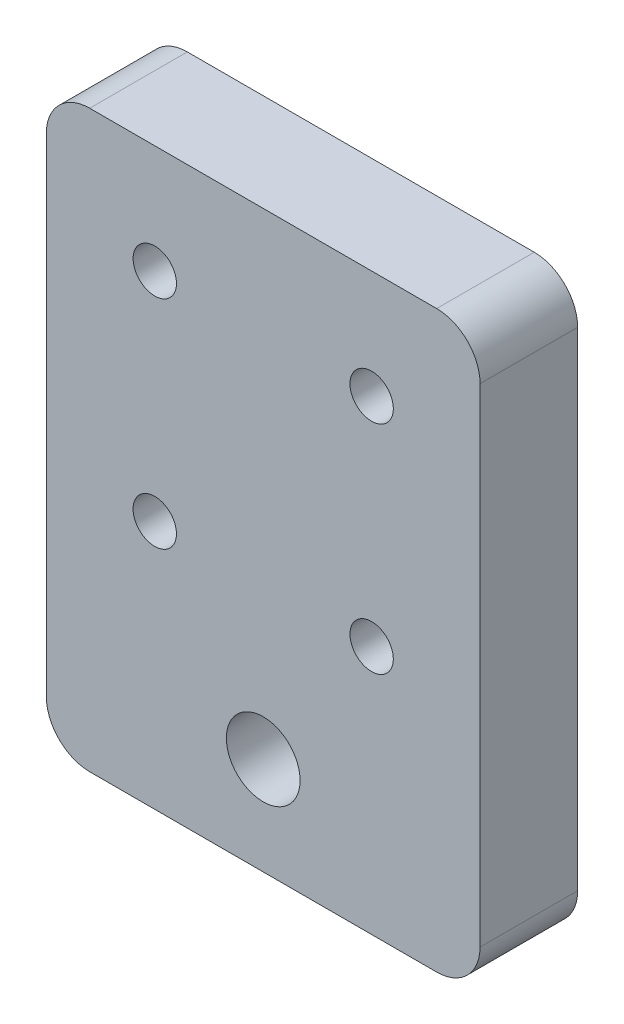
ISO-10303-21;
HEADER;
FILE_DESCRIPTION(('STEP AP214'),'2;1');
FILE_NAME('part.step','',(''),(''),'','','');
FILE_SCHEMA(('AUTOMOTIVE_DESIGN { 1 0 10303 214 1 1 1 1 }'));
ENDSEC;
DATA;
#1=APPLICATION_CONTEXT('core data for automotive mechanical design processes');
#2=APPLICATION_PROTOCOL_DEFINITION('international standard','automotive_design',2000,#1);
#3=PRODUCT_CONTEXT('',#1,'mechanical');
#4=PRODUCT('Part','Part','',(#3));
#5=PRODUCT_RELATED_PRODUCT_CATEGORY('part','',(#4));
#6=PRODUCT_DEFINITION_FORMATION('','',#4);
#7=PRODUCT_DEFINITION_CONTEXT('part definition',#1,'design');
#8=PRODUCT_DEFINITION('design','',#6,#7);
#9=PRODUCT_DEFINITION_SHAPE('','',#8);
#10=(LENGTH_UNIT() NAMED_UNIT(*) SI_UNIT(.MILLI.,.METRE.));
#11=(NAMED_UNIT(*) PLANE_ANGLE_UNIT() SI_UNIT($,.RADIAN.));
#12=(NAMED_UNIT(*) SI_UNIT($,.STERADIAN.) SOLID_ANGLE_UNIT());
#13=UNCERTAINTY_MEASURE_WITH_UNIT(LENGTH_MEASURE(1.E-05),#10,'distance_accuracy_value','');
#14=(GEOMETRIC_REPRESENTATION_CONTEXT(3) GLOBAL_UNCERTAINTY_ASSIGNED_CONTEXT((#13)) GLOBAL_UNIT_ASSIGNED_CONTEXT((#10,
#11,#12)) REPRESENTATION_CONTEXT('',''));
#15=CARTESIAN_POINT('',(0.,0.,0.));
#16=DIRECTION('',(0.,0.,1.));
#17=DIRECTION('',(1.,0.,0.));
#18=AXIS2_PLACEMENT_3D('',#15,#16,#17);
#19=CARTESIAN_POINT('',(0.,0.,9.));
#20=DIRECTION('',(1.,0.,0.));
#21=DIRECTION('',(0.,0.,-1.));
#22=AXIS2_PLACEMENT_3D('',#19,#20,#21);
#23=PLANE('',#22);
#24=DIRECTION('',(0.,-1.,0.));
#25=VECTOR('',#24,1.);
#26=CARTESIAN_POINT('',(0.,0.,0.));
#27=LINE('',#26,#25);
#28=CARTESIAN_POINT('',(0.,49.,0.));
#29=VERTEX_POINT('',#28);
#30=CARTESIAN_POINT('',(0.,4.,0.));
#31=VERTEX_POINT('',#30);
#32=EDGE_CURVE('E157',#29,#31,#27,.T.);
#33=ORIENTED_EDGE('',*,*,#32,.T.);
#34=DIRECTION('',(0.,0.,-1.));
#35=VECTOR('',#34,1.);
#36=CARTESIAN_POINT('',(0.,4.,9.));
#37=LINE('',#36,#35);
#38=CARTESIAN_POINT('',(0.,4.,9.));
#39=VERTEX_POINT('',#38);
#40=EDGE_CURVE('E11',#31,#39,#37,.F.);
#41=ORIENTED_EDGE('',*,*,#40,.T.);
#42=DIRECTION('',(0.,-1.,0.));
#43=VECTOR('',#42,1.);
#44=CARTESIAN_POINT('',(0.,0.,9.));
#45=LINE('',#44,#43);
#46=CARTESIAN_POINT('',(0.,49.,9.));
#47=VERTEX_POINT('',#46);
#48=EDGE_CURVE('E125',#47,#39,#45,.T.);
#49=ORIENTED_EDGE('',*,*,#48,.F.);
#50=DIRECTION('',(0.,0.,-1.));
#51=VECTOR('',#50,1.);
#52=CARTESIAN_POINT('',(0.,49.,9.));
#53=LINE('',#52,#51);
#54=EDGE_CURVE('E41',#47,#29,#53,.T.);
#55=ORIENTED_EDGE('',*,*,#54,.T.);
#56=EDGE_LOOP('',(#33,#41,#49,#55));
#57=FACE_BOUND('',#56,.T.);
#58=ADVANCED_FACE('F33',(#57),#23,.F.);
#59=CARTESIAN_POINT('',(0.,0.,9.));
#60=DIRECTION('',(0.,1.,0.));
#61=DIRECTION('',(0.,0.,1.));
#62=AXIS2_PLACEMENT_3D('',#59,#60,#61);
#63=PLANE('',#62);
#64=DIRECTION('',(1.,0.,0.));
#65=VECTOR('',#64,1.);
#66=CARTESIAN_POINT('',(0.,0.,0.));
#67=LINE('',#66,#65);
#68=CARTESIAN_POINT('',(4.,0.,0.));
#69=VERTEX_POINT('',#68);
#70=CARTESIAN_POINT('',(36.,0.,0.));
#71=VERTEX_POINT('',#70);
#72=EDGE_CURVE('E130',#69,#71,#67,.T.);
#73=ORIENTED_EDGE('',*,*,#72,.T.);
#74=DIRECTION('',(0.,0.,-1.));
#75=VECTOR('',#74,1.);
#76=CARTESIAN_POINT('',(36.,0.,9.));
#77=LINE('',#76,#75);
#78=CARTESIAN_POINT('',(36.,0.,9.));
#79=VERTEX_POINT('',#78);
#80=EDGE_CURVE('E48',#71,#79,#77,.F.);
#81=ORIENTED_EDGE('',*,*,#80,.T.);
#82=DIRECTION('',(1.,0.,0.));
#83=VECTOR('',#82,1.);
#84=CARTESIAN_POINT('',(0.,0.,9.));
#85=LINE('',#84,#83);
#86=CARTESIAN_POINT('',(4.,0.,9.));
#87=VERTEX_POINT('',#86);
#88=EDGE_CURVE('E128',#87,#79,#85,.T.);
#89=ORIENTED_EDGE('',*,*,#88,.F.);
#90=DIRECTION('',(0.,0.,-1.));
#91=VECTOR('',#90,1.);
#92=CARTESIAN_POINT('',(4.,0.,9.));
#93=LINE('',#92,#91);
#94=EDGE_CURVE('E149',#87,#69,#93,.T.);
#95=ORIENTED_EDGE('',*,*,#94,.T.);
#96=EDGE_LOOP('',(#73,#81,#89,#95));
#97=FACE_BOUND('',#96,.T.);
#98=ADVANCED_FACE('F227',(#97),#63,.F.);
#99=CARTESIAN_POINT('',(40.,0.,9.));
#100=DIRECTION('',(-1.,0.,0.));
#101=DIRECTION('',(0.,0.,1.));
#102=AXIS2_PLACEMENT_3D('',#99,#100,#101);
#103=PLANE('',#102);
#104=DIRECTION('',(0.,1.,0.));
#105=VECTOR('',#104,1.);
#106=CARTESIAN_POINT('',(40.,0.,0.));
#107=LINE('',#106,#105);
#108=CARTESIAN_POINT('',(40.,4.,0.));
#109=VERTEX_POINT('',#108);
#110=CARTESIAN_POINT('',(40.,49.,0.));
#111=VERTEX_POINT('',#110);
#112=EDGE_CURVE('E126',#109,#111,#107,.T.);
#113=ORIENTED_EDGE('',*,*,#112,.T.);
#114=DIRECTION('',(0.,0.,-1.));
#115=VECTOR('',#114,1.);
#116=CARTESIAN_POINT('',(40.,49.,9.));
#117=LINE('',#116,#115);
#118=CARTESIAN_POINT('',(40.,49.,9.));
#119=VERTEX_POINT('',#118);
#120=EDGE_CURVE('E104',#111,#119,#117,.F.);
#121=ORIENTED_EDGE('',*,*,#120,.T.);
#122=DIRECTION('',(0.,1.,0.));
#123=VECTOR('',#122,1.);
#124=CARTESIAN_POINT('',(40.,0.,9.));
#125=LINE('',#124,#123);
#126=CARTESIAN_POINT('',(40.,4.,9.));
#127=VERTEX_POINT('',#126);
#128=EDGE_CURVE('E169',#127,#119,#125,.T.);
#129=ORIENTED_EDGE('',*,*,#128,.F.);
#130=DIRECTION('',(0.,0.,-1.));
#131=VECTOR('',#130,1.);
#132=CARTESIAN_POINT('',(40.,4.,9.));
#133=LINE('',#132,#131);
#134=EDGE_CURVE('E109',#127,#109,#133,.T.);
#135=ORIENTED_EDGE('',*,*,#134,.T.);
#136=EDGE_LOOP('',(#113,#121,#129,#135));
#137=FACE_BOUND('',#136,.T.);
#138=ADVANCED_FACE('F224',(#137),#103,.F.);
#139=CARTESIAN_POINT('',(0.,53.,9.));
#140=DIRECTION('',(0.,-1.,0.));
#141=DIRECTION('',(0.,0.,-1.));
#142=AXIS2_PLACEMENT_3D('',#139,#140,#141);
#143=PLANE('',#142);
#144=DIRECTION('',(-1.,0.,0.));
#145=VECTOR('',#144,1.);
#146=CARTESIAN_POINT('',(0.,53.,9.));
#147=LINE('',#146,#145);
#148=CARTESIAN_POINT('',(36.,53.,9.));
#149=VERTEX_POINT('',#148);
#150=CARTESIAN_POINT('',(4.,53.,9.));
#151=VERTEX_POINT('',#150);
#152=EDGE_CURVE('E119',#149,#151,#147,.T.);
#153=ORIENTED_EDGE('',*,*,#152,.F.);
#154=DIRECTION('',(0.,0.,-1.));
#155=VECTOR('',#154,1.);
#156=CARTESIAN_POINT('',(36.,53.,9.));
#157=LINE('',#156,#155);
#158=CARTESIAN_POINT('',(36.,53.,0.));
#159=VERTEX_POINT('',#158);
#160=EDGE_CURVE('E103',#149,#159,#157,.T.);
#161=ORIENTED_EDGE('',*,*,#160,.T.);
#162=DIRECTION('',(-1.,0.,0.));
#163=VECTOR('',#162,1.);
#164=CARTESIAN_POINT('',(0.,53.,0.));
#165=LINE('',#164,#163);
#166=CARTESIAN_POINT('',(4.,53.,0.));
#167=VERTEX_POINT('',#166);
#168=EDGE_CURVE('E116',#159,#167,#165,.T.);
#169=ORIENTED_EDGE('',*,*,#168,.T.);
#170=DIRECTION('',(0.,0.,-1.));
#171=VECTOR('',#170,1.);
#172=CARTESIAN_POINT('',(4.,53.,9.));
#173=LINE('',#172,#171);
#174=EDGE_CURVE('E121',#167,#151,#173,.F.);
#175=ORIENTED_EDGE('',*,*,#174,.T.);
#176=EDGE_LOOP('',(#153,#161,#169,#175));
#177=FACE_BOUND('',#176,.T.);
#178=ADVANCED_FACE('F115',(#177),#143,.F.);
#179=CARTESIAN_POINT('',(0.,0.,9.));
#180=DIRECTION('',(0.,0.,-1.));
#181=DIRECTION('',(-1.,0.,0.));
#182=AXIS2_PLACEMENT_3D('',#179,#180,#181);
#183=PLANE('',#182);
#184=CARTESIAN_POINT('',(30.,43.,9.));
#185=DIRECTION('',(0.,0.,1.));
#186=DIRECTION('',(-1.,0.,0.));
#187=AXIS2_PLACEMENT_3D('',#184,#185,#186);
#188=CIRCLE('',#187,2.);
#189=CARTESIAN_POINT('',(28.,43.,9.));
#190=VERTEX_POINT('',#189);
#191=EDGE_CURVE('E194',#190,#190,#188,.T.);
#192=ORIENTED_EDGE('',*,*,#191,.F.);
#193=EDGE_LOOP('',(#192));
#194=FACE_BOUND('',#193,.T.);
#195=CARTESIAN_POINT('',(30.,23.,9.));
#196=DIRECTION('',(0.,0.,1.));
#197=DIRECTION('',(1.,0.,0.));
#198=AXIS2_PLACEMENT_3D('',#195,#196,#197);
#199=CIRCLE('',#198,2.);
#200=CARTESIAN_POINT('',(32.,23.,9.));
#201=VERTEX_POINT('',#200);
#202=EDGE_CURVE('E188',#201,#201,#199,.T.);
#203=ORIENTED_EDGE('',*,*,#202,.F.);
#204=EDGE_LOOP('',(#203));
#205=FACE_BOUND('',#204,.T.);
#206=CARTESIAN_POINT('',(10.,23.,9.));
#207=DIRECTION('',(0.,0.,1.));
#208=DIRECTION('',(-1.,0.,0.));
#209=AXIS2_PLACEMENT_3D('',#206,#207,#208);
#210=CIRCLE('',#209,2.);
#211=CARTESIAN_POINT('',(8.,23.,9.));
#212=VERTEX_POINT('',#211);
#213=EDGE_CURVE('E182',#212,#212,#210,.T.);
#214=ORIENTED_EDGE('',*,*,#213,.F.);
#215=EDGE_LOOP('',(#214));
#216=FACE_BOUND('',#215,.T.);
#217=CARTESIAN_POINT('',(20.,8.99999999999999,9.));
#218=DIRECTION('',(0.,0.,1.));
#219=DIRECTION('',(1.,0.,0.));
#220=AXIS2_PLACEMENT_3D('',#217,#218,#219);
#221=CIRCLE('',#220,3.4);
#222=CARTESIAN_POINT('',(23.4,8.99999999999999,9.));
#223=VERTEX_POINT('',#222);
#224=EDGE_CURVE('E176',#223,#223,#221,.T.);
#225=ORIENTED_EDGE('',*,*,#224,.F.);
#226=EDGE_LOOP('',(#225));
#227=FACE_BOUND('',#226,.T.);
#228=CARTESIAN_POINT('',(10.,43.,9.));
#229=DIRECTION('',(0.,0.,1.));
#230=DIRECTION('',(1.,0.,0.));
#231=AXIS2_PLACEMENT_3D('',#228,#229,#230);
#232=CIRCLE('',#231,2.);
#233=CARTESIAN_POINT('',(12.,43.,9.));
#234=VERTEX_POINT('',#233);
#235=EDGE_CURVE('E165',#234,#234,#232,.T.);
#236=ORIENTED_EDGE('',*,*,#235,.F.);
#237=EDGE_LOOP('',(#236));
#238=FACE_BOUND('',#237,.T.);
#239=ORIENTED_EDGE('',*,*,#128,.T.);
#240=CARTESIAN_POINT('',(36.,49.,9.));
#241=DIRECTION('',(0.,0.,-1.));
#242=DIRECTION('',(-1.,0.,0.));
#243=AXIS2_PLACEMENT_3D('',#240,#241,#242);
#244=CIRCLE('',#243,4.);
#245=EDGE_CURVE('E147',#119,#149,#244,.F.);
#246=ORIENTED_EDGE('',*,*,#245,.T.);
#247=ORIENTED_EDGE('',*,*,#152,.T.);
#248=CARTESIAN_POINT('',(4.,49.,9.));
#249=DIRECTION('',(0.,0.,-1.));
#250=DIRECTION('',(-1.,0.,0.));
#251=AXIS2_PLACEMENT_3D('',#248,#249,#250);
#252=CIRCLE('',#251,4.);
#253=EDGE_CURVE('E142',#151,#47,#252,.F.);
#254=ORIENTED_EDGE('',*,*,#253,.T.);
#255=ORIENTED_EDGE('',*,*,#48,.T.);
#256=CARTESIAN_POINT('',(4.,4.,9.));
#257=DIRECTION('',(0.,0.,-1.));
#258=DIRECTION('',(-1.,0.,0.));
#259=AXIS2_PLACEMENT_3D('',#256,#257,#258);
#260=CIRCLE('',#259,4.);
#261=EDGE_CURVE('E55',#39,#87,#260,.F.);
#262=ORIENTED_EDGE('',*,*,#261,.T.);
#263=ORIENTED_EDGE('',*,*,#88,.T.);
#264=CARTESIAN_POINT('',(36.,4.,9.));
#265=DIRECTION('',(0.,0.,-1.));
#266=DIRECTION('',(-1.,0.,0.));
#267=AXIS2_PLACEMENT_3D('',#264,#265,#266);
#268=CIRCLE('',#267,4.);
#269=EDGE_CURVE('E145',#79,#127,#268,.F.);
#270=ORIENTED_EDGE('',*,*,#269,.T.);
#271=EDGE_LOOP('',(#239,#246,#247,#254,#255,#262,#263,#270));
#272=FACE_BOUND('',#271,.T.);
#273=ADVANCED_FACE('F209',(#194,#205,#216,#227,#238,#272),#183,.F.);
#274=CARTESIAN_POINT('',(0.,0.,0.));
#275=DIRECTION('',(0.,0.,-1.));
#276=DIRECTION('',(-1.,0.,0.));
#277=AXIS2_PLACEMENT_3D('',#274,#275,#276);
#278=PLANE('',#277);
#279=CARTESIAN_POINT('',(30.,43.,0.));
#280=DIRECTION('',(0.,0.,1.));
#281=DIRECTION('',(-1.,0.,0.));
#282=AXIS2_PLACEMENT_3D('',#279,#280,#281);
#283=CIRCLE('',#282,2.);
#284=CARTESIAN_POINT('',(28.,43.,0.));
#285=VERTEX_POINT('',#284);
#286=EDGE_CURVE('E174',#285,#285,#283,.T.);
#287=ORIENTED_EDGE('',*,*,#286,.T.);
#288=EDGE_LOOP('',(#287));
#289=FACE_BOUND('',#288,.T.);
#290=CARTESIAN_POINT('',(30.,23.,0.));
#291=DIRECTION('',(0.,0.,1.));
#292=DIRECTION('',(1.,0.,0.));
#293=AXIS2_PLACEMENT_3D('',#290,#291,#292);
#294=CIRCLE('',#293,2.);
#295=CARTESIAN_POINT('',(32.,23.,0.));
#296=VERTEX_POINT('',#295);
#297=EDGE_CURVE('E191',#296,#296,#294,.T.);
#298=ORIENTED_EDGE('',*,*,#297,.T.);
#299=EDGE_LOOP('',(#298));
#300=FACE_BOUND('',#299,.T.);
#301=CARTESIAN_POINT('',(10.,23.,0.));
#302=DIRECTION('',(0.,0.,1.));
#303=DIRECTION('',(-1.,0.,0.));
#304=AXIS2_PLACEMENT_3D('',#301,#302,#303);
#305=CIRCLE('',#304,2.);
#306=CARTESIAN_POINT('',(8.,23.,0.));
#307=VERTEX_POINT('',#306);
#308=EDGE_CURVE('E185',#307,#307,#305,.T.);
#309=ORIENTED_EDGE('',*,*,#308,.T.);
#310=EDGE_LOOP('',(#309));
#311=FACE_BOUND('',#310,.T.);
#312=CARTESIAN_POINT('',(20.,8.99999999999999,0.));
#313=DIRECTION('',(0.,0.,1.));
#314=DIRECTION('',(1.,0.,0.));
#315=AXIS2_PLACEMENT_3D('',#312,#313,#314);
#316=CIRCLE('',#315,3.4);
#317=CARTESIAN_POINT('',(23.4,8.99999999999999,0.));
#318=VERTEX_POINT('',#317);
#319=EDGE_CURVE('E179',#318,#318,#316,.T.);
#320=ORIENTED_EDGE('',*,*,#319,.T.);
#321=EDGE_LOOP('',(#320));
#322=FACE_BOUND('',#321,.T.);
#323=CARTESIAN_POINT('',(10.,43.,0.));
#324=DIRECTION('',(0.,0.,1.));
#325=DIRECTION('',(1.,0.,0.));
#326=AXIS2_PLACEMENT_3D('',#323,#324,#325);
#327=CIRCLE('',#326,2.);
#328=CARTESIAN_POINT('',(12.,43.,0.));
#329=VERTEX_POINT('',#328);
#330=EDGE_CURVE('E162',#329,#329,#327,.T.);
#331=ORIENTED_EDGE('',*,*,#330,.T.);
#332=EDGE_LOOP('',(#331));
#333=FACE_BOUND('',#332,.T.);
#334=ORIENTED_EDGE('',*,*,#168,.F.);
#335=CARTESIAN_POINT('',(36.,49.,0.));
#336=DIRECTION('',(0.,0.,-1.));
#337=DIRECTION('',(-1.,0.,0.));
#338=AXIS2_PLACEMENT_3D('',#335,#336,#337);
#339=CIRCLE('',#338,4.);
#340=EDGE_CURVE('E99',#159,#111,#339,.T.);
#341=ORIENTED_EDGE('',*,*,#340,.T.);
#342=ORIENTED_EDGE('',*,*,#112,.F.);
#343=CARTESIAN_POINT('',(36.,4.,0.));
#344=DIRECTION('',(0.,0.,-1.));
#345=DIRECTION('',(-1.,0.,0.));
#346=AXIS2_PLACEMENT_3D('',#343,#344,#345);
#347=CIRCLE('',#346,4.);
#348=EDGE_CURVE('E110',#109,#71,#347,.T.);
#349=ORIENTED_EDGE('',*,*,#348,.T.);
#350=ORIENTED_EDGE('',*,*,#72,.F.);
#351=CARTESIAN_POINT('',(4.,4.,0.));
#352=DIRECTION('',(0.,0.,-1.));
#353=DIRECTION('',(-1.,0.,0.));
#354=AXIS2_PLACEMENT_3D('',#351,#352,#353);
#355=CIRCLE('',#354,4.);
#356=EDGE_CURVE('E136',#69,#31,#355,.T.);
#357=ORIENTED_EDGE('',*,*,#356,.T.);
#358=ORIENTED_EDGE('',*,*,#32,.F.);
#359=CARTESIAN_POINT('',(4.,49.,0.));
#360=DIRECTION('',(0.,0.,-1.));
#361=DIRECTION('',(-1.,0.,0.));
#362=AXIS2_PLACEMENT_3D('',#359,#360,#361);
#363=CIRCLE('',#362,4.);
#364=EDGE_CURVE('E120',#29,#167,#363,.T.);
#365=ORIENTED_EDGE('',*,*,#364,.T.);
#366=EDGE_LOOP('',(#334,#341,#342,#349,#350,#357,#358,#365));
#367=FACE_BOUND('',#366,.T.);
#368=ADVANCED_FACE('F123',(#289,#300,#311,#322,#333,#367),#278,.T.);
#369=CARTESIAN_POINT('',(10.,43.,0.));
#370=DIRECTION('',(0.,0.,1.));
#371=DIRECTION('',(1.,0.,0.));
#372=AXIS2_PLACEMENT_3D('',#369,#370,#371);
#373=CYLINDRICAL_SURFACE('',#372,2.);
#374=ORIENTED_EDGE('',*,*,#330,.F.);
#375=EDGE_LOOP('',(#374));
#376=FACE_BOUND('',#375,.T.);
#377=ORIENTED_EDGE('',*,*,#235,.T.);
#378=EDGE_LOOP('',(#377));
#379=FACE_BOUND('',#378,.T.);
#380=ADVANCED_FACE('F298',(#376,#379),#373,.F.);
#381=CARTESIAN_POINT('',(20.,8.99999999999999,0.));
#382=DIRECTION('',(0.,0.,1.));
#383=DIRECTION('',(1.,0.,0.));
#384=AXIS2_PLACEMENT_3D('',#381,#382,#383);
#385=CYLINDRICAL_SURFACE('',#384,3.4);
#386=ORIENTED_EDGE('',*,*,#319,.F.);
#387=EDGE_LOOP('',(#386));
#388=FACE_BOUND('',#387,.T.);
#389=ORIENTED_EDGE('',*,*,#224,.T.);
#390=EDGE_LOOP('',(#389));
#391=FACE_BOUND('',#390,.T.);
#392=ADVANCED_FACE('F289',(#388,#391),#385,.F.);
#393=CARTESIAN_POINT('',(10.,23.,0.));
#394=DIRECTION('',(0.,0.,1.));
#395=DIRECTION('',(1.,0.,0.));
#396=AXIS2_PLACEMENT_3D('',#393,#394,#395);
#397=CYLINDRICAL_SURFACE('',#396,2.);
#398=ORIENTED_EDGE('',*,*,#308,.F.);
#399=EDGE_LOOP('',(#398));
#400=FACE_BOUND('',#399,.T.);
#401=ORIENTED_EDGE('',*,*,#213,.T.);
#402=EDGE_LOOP('',(#401));
#403=FACE_BOUND('',#402,.T.);
#404=ADVANCED_FACE('F280',(#400,#403),#397,.F.);
#405=CARTESIAN_POINT('',(30.,23.,0.));
#406=DIRECTION('',(0.,0.,1.));
#407=DIRECTION('',(1.,0.,0.));
#408=AXIS2_PLACEMENT_3D('',#405,#406,#407);
#409=CYLINDRICAL_SURFACE('',#408,2.);
#410=ORIENTED_EDGE('',*,*,#297,.F.);
#411=EDGE_LOOP('',(#410));
#412=FACE_BOUND('',#411,.T.);
#413=ORIENTED_EDGE('',*,*,#202,.T.);
#414=EDGE_LOOP('',(#413));
#415=FACE_BOUND('',#414,.T.);
#416=ADVANCED_FACE('F205',(#412,#415),#409,.F.);
#417=CARTESIAN_POINT('',(30.,43.,0.));
#418=DIRECTION('',(0.,0.,1.));
#419=DIRECTION('',(1.,0.,0.));
#420=AXIS2_PLACEMENT_3D('',#417,#418,#419);
#421=CYLINDRICAL_SURFACE('',#420,2.);
#422=ORIENTED_EDGE('',*,*,#286,.F.);
#423=EDGE_LOOP('',(#422));
#424=FACE_BOUND('',#423,.T.);
#425=ORIENTED_EDGE('',*,*,#191,.T.);
#426=EDGE_LOOP('',(#425));
#427=FACE_BOUND('',#426,.T.);
#428=ADVANCED_FACE('F202',(#424,#427),#421,.F.);
#429=CARTESIAN_POINT('',(36.,49.,9.));
#430=DIRECTION('',(0.,0.,-1.));
#431=DIRECTION('',(-1.,0.,0.));
#432=AXIS2_PLACEMENT_3D('',#429,#430,#431);
#433=CYLINDRICAL_SURFACE('',#432,4.);
#434=ORIENTED_EDGE('',*,*,#245,.F.);
#435=ORIENTED_EDGE('',*,*,#120,.F.);
#436=ORIENTED_EDGE('',*,*,#340,.F.);
#437=ORIENTED_EDGE('',*,*,#160,.F.);
#438=EDGE_LOOP('',(#434,#435,#436,#437));
#439=FACE_BOUND('',#438,.T.);
#440=ADVANCED_FACE('F102',(#439),#433,.T.);
#441=CARTESIAN_POINT('',(36.,4.,9.));
#442=DIRECTION('',(0.,0.,-1.));
#443=DIRECTION('',(-1.,0.,0.));
#444=AXIS2_PLACEMENT_3D('',#441,#442,#443);
#445=CYLINDRICAL_SURFACE('',#444,4.);
#446=ORIENTED_EDGE('',*,*,#269,.F.);
#447=ORIENTED_EDGE('',*,*,#80,.F.);
#448=ORIENTED_EDGE('',*,*,#348,.F.);
#449=ORIENTED_EDGE('',*,*,#134,.F.);
#450=EDGE_LOOP('',(#446,#447,#448,#449));
#451=FACE_BOUND('',#450,.T.);
#452=ADVANCED_FACE('F226',(#451),#445,.T.);
#453=CARTESIAN_POINT('',(4.,4.,9.));
#454=DIRECTION('',(0.,0.,-1.));
#455=DIRECTION('',(-1.,0.,0.));
#456=AXIS2_PLACEMENT_3D('',#453,#454,#455);
#457=CYLINDRICAL_SURFACE('',#456,4.);
#458=ORIENTED_EDGE('',*,*,#261,.F.);
#459=ORIENTED_EDGE('',*,*,#40,.F.);
#460=ORIENTED_EDGE('',*,*,#356,.F.);
#461=ORIENTED_EDGE('',*,*,#94,.F.);
#462=EDGE_LOOP('',(#458,#459,#460,#461));
#463=FACE_BOUND('',#462,.T.);
#464=ADVANCED_FACE('F230',(#463),#457,.T.);
#465=CARTESIAN_POINT('',(4.,49.,9.));
#466=DIRECTION('',(0.,0.,-1.));
#467=DIRECTION('',(-1.,0.,0.));
#468=AXIS2_PLACEMENT_3D('',#465,#466,#467);
#469=CYLINDRICAL_SURFACE('',#468,4.);
#470=ORIENTED_EDGE('',*,*,#253,.F.);
#471=ORIENTED_EDGE('',*,*,#174,.F.);
#472=ORIENTED_EDGE('',*,*,#364,.F.);
#473=ORIENTED_EDGE('',*,*,#54,.F.);
#474=EDGE_LOOP('',(#470,#471,#472,#473));
#475=FACE_BOUND('',#474,.T.);
#476=ADVANCED_FACE('F35',(#475),#469,.T.);
#477=CLOSED_SHELL('',(#58,#98,#138,#178,#273,#368,#380,#392,#404,#416,#428,#440,#452,#464,#476));
#478=MANIFOLD_SOLID_BREP('B2',#477);
#479=ADVANCED_BREP_SHAPE_REPRESENTATION('',(#18,#478),#14);
#480=SHAPE_DEFINITION_REPRESENTATION(#9,#479);
ENDSEC;
END-ISO-10303-21;
